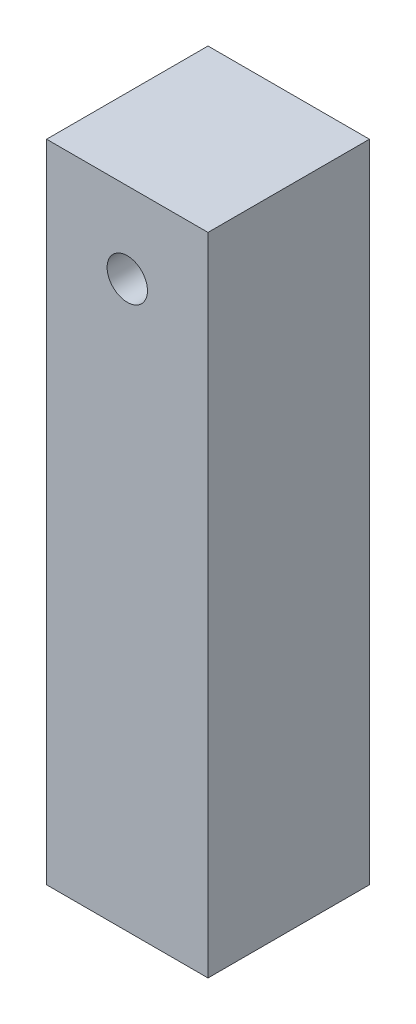
ISO-10303-21;
HEADER;
FILE_DESCRIPTION(('STEP AP214'),'2;1');
FILE_NAME('part.step','',(''),(''),'','','');
FILE_SCHEMA(('AUTOMOTIVE_DESIGN { 1 0 10303 214 1 1 1 1 }'));
ENDSEC;
DATA;
#1=APPLICATION_CONTEXT('core data for automotive mechanical design processes');
#2=APPLICATION_PROTOCOL_DEFINITION('international standard','automotive_design',2000,#1);
#3=PRODUCT_CONTEXT('',#1,'mechanical');
#4=PRODUCT('Part','Part','',(#3));
#5=PRODUCT_RELATED_PRODUCT_CATEGORY('part','',(#4));
#6=PRODUCT_DEFINITION_FORMATION('','',#4);
#7=PRODUCT_DEFINITION_CONTEXT('part definition',#1,'design');
#8=PRODUCT_DEFINITION('design','',#6,#7);
#9=PRODUCT_DEFINITION_SHAPE('','',#8);
#10=(LENGTH_UNIT() NAMED_UNIT(*) SI_UNIT(.MILLI.,.METRE.));
#11=(NAMED_UNIT(*) PLANE_ANGLE_UNIT() SI_UNIT($,.RADIAN.));
#12=(NAMED_UNIT(*) SI_UNIT($,.STERADIAN.) SOLID_ANGLE_UNIT());
#13=UNCERTAINTY_MEASURE_WITH_UNIT(LENGTH_MEASURE(1.E-05),#10,'distance_accuracy_value','');
#14=(GEOMETRIC_REPRESENTATION_CONTEXT(3) GLOBAL_UNCERTAINTY_ASSIGNED_CONTEXT((#13)) GLOBAL_UNIT_ASSIGNED_CONTEXT((#10,
#11,#12)) REPRESENTATION_CONTEXT('',''));
#15=CARTESIAN_POINT('',(0.,0.,0.));
#16=DIRECTION('',(0.,0.,1.));
#17=DIRECTION('',(1.,0.,0.));
#18=AXIS2_PLACEMENT_3D('',#15,#16,#17);
#19=CARTESIAN_POINT('',(-14.5329896907216,101.6,-11.9144329896907));
#20=DIRECTION('',(1.,0.,0.));
#21=DIRECTION('',(0.,0.,-1.));
#22=AXIS2_PLACEMENT_3D('',#19,#20,#21);
#23=PLANE('',#22);
#24=DIRECTION('',(0.,0.,1.));
#25=VECTOR('',#24,1.);
#26=CARTESIAN_POINT('',(-14.5329896907216,0.,-11.9144329896907));
#27=LINE('',#26,#25);
#28=CARTESIAN_POINT('',(-14.5329896907216,0.,-11.9144329896907));
#29=VERTEX_POINT('',#28);
#30=CARTESIAN_POINT('',(-14.5329896907216,0.,13.4855670103093));
#31=VERTEX_POINT('',#30);
#32=EDGE_CURVE('E98',#29,#31,#27,.T.);
#33=ORIENTED_EDGE('',*,*,#32,.T.);
#34=DIRECTION('',(0.,-1.,0.));
#35=VECTOR('',#34,1.);
#36=CARTESIAN_POINT('',(-14.5329896907216,101.6,13.4855670103093));
#37=LINE('',#36,#35);
#38=CARTESIAN_POINT('',(-14.5329896907216,101.6,13.4855670103093));
#39=VERTEX_POINT('',#38);
#40=EDGE_CURVE('E11',#39,#31,#37,.T.);
#41=ORIENTED_EDGE('',*,*,#40,.F.);
#42=DIRECTION('',(0.,0.,1.));
#43=VECTOR('',#42,1.);
#44=CARTESIAN_POINT('',(-14.5329896907216,101.6,-11.9144329896907));
#45=LINE('',#44,#43);
#46=CARTESIAN_POINT('',(-14.5329896907216,101.6,-11.9144329896907));
#47=VERTEX_POINT('',#46);
#48=EDGE_CURVE('E85',#47,#39,#45,.T.);
#49=ORIENTED_EDGE('',*,*,#48,.F.);
#50=DIRECTION('',(0.,-1.,0.));
#51=VECTOR('',#50,1.);
#52=CARTESIAN_POINT('',(-14.5329896907216,101.6,-11.9144329896907));
#53=LINE('',#52,#51);
#54=EDGE_CURVE('E94',#47,#29,#53,.T.);
#55=ORIENTED_EDGE('',*,*,#54,.T.);
#56=EDGE_LOOP('',(#33,#41,#49,#55));
#57=FACE_BOUND('',#56,.T.);
#58=ADVANCED_FACE('F33',(#57),#23,.F.);
#59=CARTESIAN_POINT('',(10.8670103092784,101.6,13.4855670103093));
#60=DIRECTION('',(0.,0.,-1.));
#61=DIRECTION('',(-1.,0.,0.));
#62=AXIS2_PLACEMENT_3D('',#59,#60,#61);
#63=PLANE('',#62);
#64=CARTESIAN_POINT('',(-1.83298969072163,88.9,13.4855670103093));
#65=DIRECTION('',(0.,0.,1.));
#66=DIRECTION('',(1.,0.,0.));
#67=AXIS2_PLACEMENT_3D('',#64,#65,#66);
#68=CIRCLE('',#67,3.175);
#69=CARTESIAN_POINT('',(1.34201030927837,88.9,13.4855670103093));
#70=VERTEX_POINT('',#69);
#71=EDGE_CURVE('E111',#70,#70,#68,.T.);
#72=ORIENTED_EDGE('',*,*,#71,.F.);
#73=EDGE_LOOP('',(#72));
#74=FACE_BOUND('',#73,.T.);
#75=DIRECTION('',(1.,0.,0.));
#76=VECTOR('',#75,1.);
#77=CARTESIAN_POINT('',(10.8670103092784,0.,13.4855670103093));
#78=LINE('',#77,#76);
#79=CARTESIAN_POINT('',(10.8670103092784,0.,13.4855670103093));
#80=VERTEX_POINT('',#79);
#81=EDGE_CURVE('E89',#31,#80,#78,.T.);
#82=ORIENTED_EDGE('',*,*,#81,.T.);
#83=DIRECTION('',(0.,-1.,0.));
#84=VECTOR('',#83,1.);
#85=CARTESIAN_POINT('',(10.8670103092784,101.6,13.4855670103093));
#86=LINE('',#85,#84);
#87=CARTESIAN_POINT('',(10.8670103092784,101.6,13.4855670103093));
#88=VERTEX_POINT('',#87);
#89=EDGE_CURVE('E42',#88,#80,#86,.T.);
#90=ORIENTED_EDGE('',*,*,#89,.F.);
#91=DIRECTION('',(1.,0.,0.));
#92=VECTOR('',#91,1.);
#93=CARTESIAN_POINT('',(10.8670103092784,101.6,13.4855670103093));
#94=LINE('',#93,#92);
#95=EDGE_CURVE('E80',#39,#88,#94,.T.);
#96=ORIENTED_EDGE('',*,*,#95,.F.);
#97=ORIENTED_EDGE('',*,*,#40,.T.);
#98=EDGE_LOOP('',(#82,#90,#96,#97));
#99=FACE_BOUND('',#98,.T.);
#100=ADVANCED_FACE('F88',(#74,#99),#63,.F.);
#101=CARTESIAN_POINT('',(10.8670103092784,101.6,-11.9144329896907));
#102=DIRECTION('',(-1.,0.,0.));
#103=DIRECTION('',(0.,0.,1.));
#104=AXIS2_PLACEMENT_3D('',#101,#102,#103);
#105=PLANE('',#104);
#106=DIRECTION('',(0.,0.,-1.));
#107=VECTOR('',#106,1.);
#108=CARTESIAN_POINT('',(10.8670103092784,0.,-11.9144329896907));
#109=LINE('',#108,#107);
#110=CARTESIAN_POINT('',(10.8670103092784,0.,-11.9144329896907));
#111=VERTEX_POINT('',#110);
#112=EDGE_CURVE('E67',#80,#111,#109,.T.);
#113=ORIENTED_EDGE('',*,*,#112,.T.);
#114=DIRECTION('',(0.,-1.,0.));
#115=VECTOR('',#114,1.);
#116=CARTESIAN_POINT('',(10.8670103092784,101.6,-11.9144329896907));
#117=LINE('',#116,#115);
#118=CARTESIAN_POINT('',(10.8670103092784,101.6,-11.9144329896907));
#119=VERTEX_POINT('',#118);
#120=EDGE_CURVE('E90',#119,#111,#117,.T.);
#121=ORIENTED_EDGE('',*,*,#120,.F.);
#122=DIRECTION('',(0.,0.,-1.));
#123=VECTOR('',#122,1.);
#124=CARTESIAN_POINT('',(10.8670103092784,101.6,-11.9144329896907));
#125=LINE('',#124,#123);
#126=EDGE_CURVE('E83',#88,#119,#125,.T.);
#127=ORIENTED_EDGE('',*,*,#126,.F.);
#128=ORIENTED_EDGE('',*,*,#89,.T.);
#129=EDGE_LOOP('',(#113,#121,#127,#128));
#130=FACE_BOUND('',#129,.T.);
#131=ADVANCED_FACE('F92',(#130),#105,.F.);
#132=CARTESIAN_POINT('',(10.8670103092784,101.6,-11.9144329896907));
#133=DIRECTION('',(0.,0.,1.));
#134=DIRECTION('',(1.,0.,0.));
#135=AXIS2_PLACEMENT_3D('',#132,#133,#134);
#136=PLANE('',#135);
#137=CARTESIAN_POINT('',(-1.83298969072163,88.9,-11.9144329896907));
#138=DIRECTION('',(0.,0.,1.));
#139=DIRECTION('',(1.,0.,0.));
#140=AXIS2_PLACEMENT_3D('',#137,#138,#139);
#141=CIRCLE('',#140,3.175);
#142=CARTESIAN_POINT('',(1.34201030927837,88.9,-11.9144329896907));
#143=VERTEX_POINT('',#142);
#144=EDGE_CURVE('E36',#143,#143,#141,.T.);
#145=ORIENTED_EDGE('',*,*,#144,.T.);
#146=EDGE_LOOP('',(#145));
#147=FACE_BOUND('',#146,.T.);
#148=DIRECTION('',(-1.,0.,0.));
#149=VECTOR('',#148,1.);
#150=CARTESIAN_POINT('',(10.8670103092784,0.,-11.9144329896907));
#151=LINE('',#150,#149);
#152=EDGE_CURVE('E73',#111,#29,#151,.T.);
#153=ORIENTED_EDGE('',*,*,#152,.T.);
#154=ORIENTED_EDGE('',*,*,#54,.F.);
#155=DIRECTION('',(-1.,0.,0.));
#156=VECTOR('',#155,1.);
#157=CARTESIAN_POINT('',(10.8670103092784,101.6,-11.9144329896907));
#158=LINE('',#157,#156);
#159=EDGE_CURVE('E50',#119,#47,#158,.T.);
#160=ORIENTED_EDGE('',*,*,#159,.F.);
#161=ORIENTED_EDGE('',*,*,#120,.T.);
#162=EDGE_LOOP('',(#153,#154,#160,#161));
#163=FACE_BOUND('',#162,.T.);
#164=ADVANCED_FACE('F105',(#147,#163),#136,.F.);
#165=CARTESIAN_POINT('',(0.,101.6,0.));
#166=DIRECTION('',(0.,-1.,0.));
#167=DIRECTION('',(0.,0.,-1.));
#168=AXIS2_PLACEMENT_3D('',#165,#166,#167);
#169=PLANE('',#168);
#170=ORIENTED_EDGE('',*,*,#48,.T.);
#171=ORIENTED_EDGE('',*,*,#95,.T.);
#172=ORIENTED_EDGE('',*,*,#126,.T.);
#173=ORIENTED_EDGE('',*,*,#159,.T.);
#174=EDGE_LOOP('',(#170,#171,#172,#173));
#175=FACE_BOUND('',#174,.T.);
#176=ADVANCED_FACE('F81',(#175),#169,.F.);
#177=CARTESIAN_POINT('',(0.,0.,0.));
#178=DIRECTION('',(0.,-1.,0.));
#179=DIRECTION('',(0.,0.,-1.));
#180=AXIS2_PLACEMENT_3D('',#177,#178,#179);
#181=PLANE('',#180);
#182=ORIENTED_EDGE('',*,*,#32,.F.);
#183=ORIENTED_EDGE('',*,*,#152,.F.);
#184=ORIENTED_EDGE('',*,*,#112,.F.);
#185=ORIENTED_EDGE('',*,*,#81,.F.);
#186=EDGE_LOOP('',(#182,#183,#184,#185));
#187=FACE_BOUND('',#186,.T.);
#188=ADVANCED_FACE('F108',(#187),#181,.T.);
#189=CARTESIAN_POINT('',(-1.83298969072163,88.9,-88.1144329896907));
#190=DIRECTION('',(0.,0.,1.));
#191=DIRECTION('',(1.,0.,0.));
#192=AXIS2_PLACEMENT_3D('',#189,#190,#191);
#193=CYLINDRICAL_SURFACE('',#192,3.175);
#194=ORIENTED_EDGE('',*,*,#71,.T.);
#195=EDGE_LOOP('',(#194));
#196=FACE_BOUND('',#195,.T.);
#197=ORIENTED_EDGE('',*,*,#144,.F.);
#198=EDGE_LOOP('',(#197));
#199=FACE_BOUND('',#198,.T.);
#200=ADVANCED_FACE('F119',(#196,#199),#193,.F.);
#201=CLOSED_SHELL('',(#58,#100,#131,#164,#176,#188,#200));
#202=MANIFOLD_SOLID_BREP('B2',#201);
#203=ADVANCED_BREP_SHAPE_REPRESENTATION('',(#18,#202),#14);
#204=SHAPE_DEFINITION_REPRESENTATION(#9,#203);
ENDSEC;
END-ISO-10303-21;
